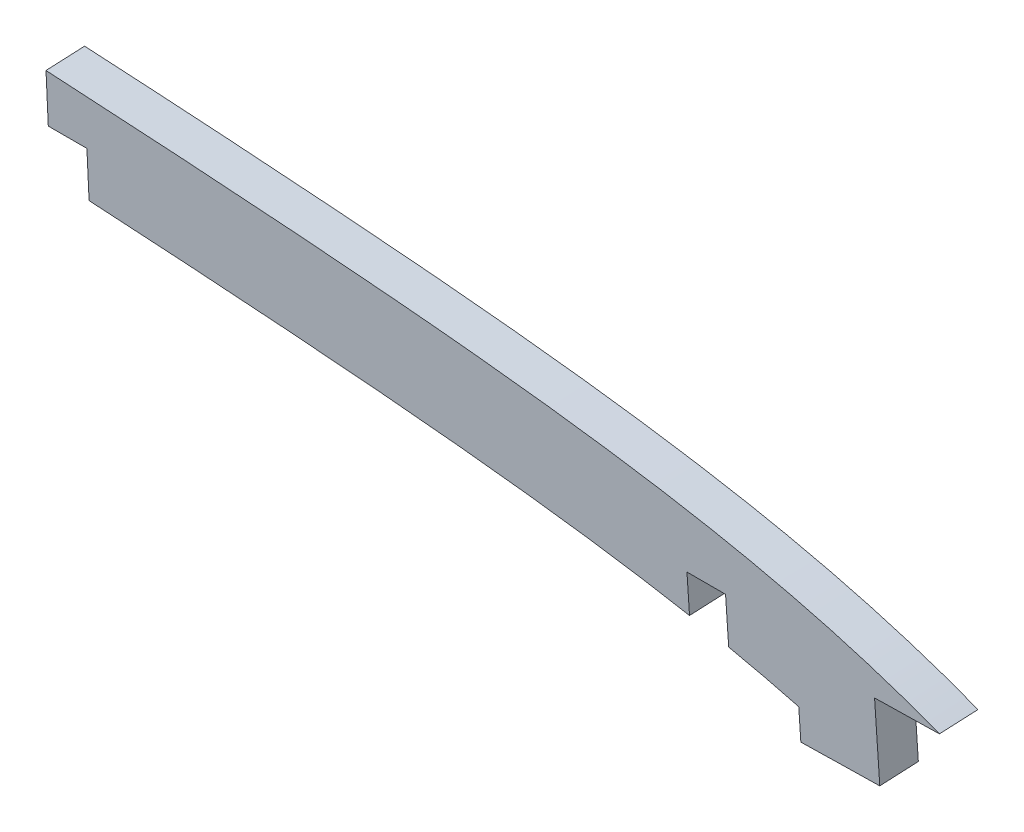
ISO-10303-21;
HEADER;
FILE_DESCRIPTION(('STEP AP214'),'2;1');
FILE_NAME('part.step','',(''),(''),'','','');
FILE_SCHEMA(('AUTOMOTIVE_DESIGN { 1 0 10303 214 1 1 1 1 }'));
ENDSEC;
DATA;
#1=APPLICATION_CONTEXT('core data for automotive mechanical design processes');
#2=APPLICATION_PROTOCOL_DEFINITION('international standard','automotive_design',2000,#1);
#3=PRODUCT_CONTEXT('',#1,'mechanical');
#4=PRODUCT('Part','Part','',(#3));
#5=PRODUCT_RELATED_PRODUCT_CATEGORY('part','',(#4));
#6=PRODUCT_DEFINITION_FORMATION('','',#4);
#7=PRODUCT_DEFINITION_CONTEXT('part definition',#1,'design');
#8=PRODUCT_DEFINITION('design','',#6,#7);
#9=PRODUCT_DEFINITION_SHAPE('','',#8);
#10=(LENGTH_UNIT() NAMED_UNIT(*) SI_UNIT(.MILLI.,.METRE.));
#11=(NAMED_UNIT(*) PLANE_ANGLE_UNIT() SI_UNIT($,.RADIAN.));
#12=(NAMED_UNIT(*) SI_UNIT($,.STERADIAN.) SOLID_ANGLE_UNIT());
#13=UNCERTAINTY_MEASURE_WITH_UNIT(LENGTH_MEASURE(1.E-05),#10,'distance_accuracy_value','');
#14=(GEOMETRIC_REPRESENTATION_CONTEXT(3) GLOBAL_UNCERTAINTY_ASSIGNED_CONTEXT((#13)) GLOBAL_UNIT_ASSIGNED_CONTEXT((#10,
#11,#12)) REPRESENTATION_CONTEXT('',''));
#15=CARTESIAN_POINT('',(0.,0.,0.));
#16=DIRECTION('',(0.,0.,1.));
#17=DIRECTION('',(1.,0.,0.));
#18=AXIS2_PLACEMENT_3D('',#15,#16,#17);
#19=CARTESIAN_POINT('',(336.677137196045,55.978239751583,-265.018424185533));
#20=CARTESIAN_POINT('',(334.08639032904,57.0574800362688,-264.968105141821));
#21=CARTESIAN_POINT('',(328.809112393071,58.8811545380873,-264.883043414682));
#22=CARTESIAN_POINT('',(320.428463569194,60.9194886283636,-264.787876019974));
#23=CARTESIAN_POINT('',(311.712141166937,62.433615193963,-264.717089630495));
#24=CARTESIAN_POINT('',(299.802782606343,63.9614455005889,-264.645545539701));
#25=CARTESIAN_POINT('',(284.637880817536,65.2628937936886,-264.584413616734));
#26=CARTESIAN_POINT('',(272.373199655927,66.066256323952,-264.546568759877));
#27=CARTESIAN_POINT('',(266.25281931719,66.4235908981517,-264.529710422424));
#28=B_SPLINE_CURVE_WITH_KNOTS('',3,(#19,#20,#21,#22,#23,#24,#25,#26,#27),.UNSPECIFIED.,.F.,.F.,
(4,1,1,1,1,1,4),(0.,0.121287595562183,0.242575191124365,0.363862786686548,0.48515038224873,
0.727725573373095,0.97030076449746),.UNSPECIFIED.);
#29=DIRECTION('',(3.75435237541071E-05,-0.046483980928917,0.998919034810872));
#30=VECTOR('',#29,1.);
#31=SURFACE_OF_LINEAR_EXTRUSION('',#28,#30);
#32=CARTESIAN_POINT('',(318.991844542654,61.1114280047069,-264.778890264956));
#33=VERTEX_POINT('',#32);
#34=CARTESIAN_POINT('',(269.874880558414,66.2068903435617,-264.539930559425));
#35=VERTEX_POINT('',#34);
#36=EDGE_CURVE('E131',#33,#35,#28,.T.);
#37=ORIENTED_EDGE('',*,*,#36,.F.);
#38=DIRECTION('',(3.75435237541071E-05,-0.046483980928917,0.998919034810872));
#39=VECTOR('',#38,1.);
#40=CARTESIAN_POINT('',(318.991844542654,61.1114280046927,-264.778890264636));
#41=LINE('',#40,#39);
#42=CARTESIAN_POINT('',(318.991963743342,60.9638413652443,-261.607322329146));
#43=VERTEX_POINT('',#42);
#44=EDGE_CURVE('E255',#33,#43,#41,.T.);
#45=ORIENTED_EDGE('',*,*,#44,.T.);
#46=CARTESIAN_POINT('',(336.677256396733,55.8306531121337,-261.846856250009));
#47=CARTESIAN_POINT('',(334.086509529727,56.9098933968195,-261.796537206296));
#48=CARTESIAN_POINT('',(328.809231593759,58.733567898638,-261.711475479158));
#49=CARTESIAN_POINT('',(320.428582769882,60.7719019889143,-261.61630808445));
#50=CARTESIAN_POINT('',(311.712260367625,62.2860285545137,-261.54552169497));
#51=CARTESIAN_POINT('',(299.802901807031,63.8138588611396,-261.473977604177));
#52=CARTESIAN_POINT('',(284.638000018224,65.1153071542393,-261.412845681209));
#53=CARTESIAN_POINT('',(272.373318856615,65.9186696845027,-261.375000824352));
#54=CARTESIAN_POINT('',(266.252938517878,66.2760042587023,-261.358142486899));
#55=B_SPLINE_CURVE_WITH_KNOTS('',3,(#46,#47,#48,#49,#50,#51,#52,#53,#54),.UNSPECIFIED.,.F.,.F.,
(4,1,1,1,1,1,4),(0.,0.121287595562183,0.242575191124365,0.363862786686548,0.48515038224873,
0.727725573373095,0.97030076449746),.UNSPECIFIED.);
#56=CARTESIAN_POINT('',(269.874999759102,66.0593037041123,-261.368362623901));
#57=VERTEX_POINT('',#56);
#58=EDGE_CURVE('E160',#43,#57,#55,.T.);
#59=ORIENTED_EDGE('',*,*,#58,.T.);
#60=DIRECTION('',(3.75435237541071E-05,-0.046483980928917,0.998919034810872));
#61=VECTOR('',#60,1.);
#62=CARTESIAN_POINT('',(269.874880558414,66.2068903435617,-264.539930559425));
#63=LINE('',#62,#61);
#64=EDGE_CURVE('E144',#35,#57,#63,.T.);
#65=ORIENTED_EDGE('',*,*,#64,.F.);
#66=EDGE_LOOP('',(#37,#45,#59,#65));
#67=FACE_BOUND('',#66,.T.);
#68=ADVANCED_FACE('F33',(#67),#31,.F.);
#69=CARTESIAN_POINT('',(266.699880799312,74.0679439383684,-264.174002738127));
#70=CARTESIAN_POINT('',(269.877550369383,73.8823221457304,-264.182759945145));
#71=CARTESIAN_POINT('',(273.054133998349,73.684406966526,-264.192089175277));
#72=CARTESIAN_POINT('',(279.404957262952,73.2620414525515,-264.211982341878));
#73=CARTESIAN_POINT('',(282.579220083787,73.0378535856233,-264.222534065467));
#74=CARTESIAN_POINT('',(288.924475008457,72.5524517291704,-264.245360373779));
#75=CARTESIAN_POINT('',(292.095475714075,72.2913351160608,-264.257630427484));
#76=CARTESIAN_POINT('',(298.432133014621,71.7086039325101,-264.2849855631));
#77=CARTESIAN_POINT('',(301.597781826907,71.3869012587405,-264.300074744543));
#78=CARTESIAN_POINT('',(306.339667277067,70.8297704762394,-264.32617864571));
#79=CARTESIAN_POINT('',(307.919193223692,70.6315789578378,-264.335460711031));
#80=CARTESIAN_POINT('',(311.075481176586,70.2039067589264,-264.355480756513));
#81=CARTESIAN_POINT('',(312.653258373727,69.9742530169902,-264.366226828118));
#82=CARTESIAN_POINT('',(317.371027628388,69.2285059736177,-264.401106945335));
#83=CARTESIAN_POINT('',(320.496662245927,68.6563155562024,-264.427850890396));
#84=CARTESIAN_POINT('',(326.689588383179,67.2879767445748,-264.491758311588));
#85=CARTESIAN_POINT('',(329.756716688684,66.4912018302597,-264.528950936246));
#86=CARTESIAN_POINT('',(334.295041763634,65.0566337106537,-264.595878104013));
#87=CARTESIAN_POINT('',(335.797388514328,64.538413977421,-264.620049552095));
#88=CARTESIAN_POINT('',(338.032747572729,63.6913706304999,-264.659550120874));
#89=CARTESIAN_POINT('',(338.774839676018,63.3974010565232,-264.673257675086));
#90=CARTESIAN_POINT('',(340.252531209307,62.7845388923394,-264.701832314176));
#91=CARTESIAN_POINT('',(340.988495660434,62.4654226926826,-264.716709818277));
#92=CARTESIAN_POINT('',(341.715968368435,62.1353756292688,-264.73209566313));
#93=B_SPLINE_CURVE_WITH_KNOTS('',3,(#69,#70,#71,#72,#73,#74,#75,#76,#77,#78,#79,#80,#81,#82,#83,
#84,#85,#86,#87,#88,#89,#90,#91,#92),.UNSPECIFIED.,.F.,.F.,(4,2,2,2,2,2,2,2,2,2,2,4),(0.,
0.124999999999999,0.249999999999999,0.374999999999998,0.499999999999998,0.562499999999999,0.625,
0.749999999999999,0.874999999999999,0.937499999999998,0.968749999999999,1.),.UNSPECIFIED.);
#94=DIRECTION('',(3.75435237541071E-05,-0.046483980928917,0.998919034810872));
#95=VECTOR('',#94,1.);
#96=SURFACE_OF_LINEAR_EXTRUSION('',#93,#95);
#97=CARTESIAN_POINT('',(266.7,73.9203572989191,-261.002434802603));
#98=CARTESIAN_POINT('',(269.877669570071,73.7347355062811,-261.011192009621));
#99=CARTESIAN_POINT('',(273.054253199037,73.5368203270767,-261.020521239752));
#100=CARTESIAN_POINT('',(279.40507646364,73.1144548131022,-261.040414406354));
#101=CARTESIAN_POINT('',(282.579339284475,72.890266946174,-261.050966129942));
#102=CARTESIAN_POINT('',(288.924594209145,72.4048650897211,-261.073792438254));
#103=CARTESIAN_POINT('',(292.095594914763,72.1437484766115,-261.086062491959));
#104=CARTESIAN_POINT('',(298.432252215309,71.5610172930608,-261.113417627575));
#105=CARTESIAN_POINT('',(301.597901027595,71.2393146192912,-261.128506809019));
#106=CARTESIAN_POINT('',(306.339786477755,70.68218383679,-261.154610710185));
#107=CARTESIAN_POINT('',(307.91931242438,70.4839923183885,-261.163892775506));
#108=CARTESIAN_POINT('',(311.075600377274,70.0563201194771,-261.183912820988));
#109=CARTESIAN_POINT('',(312.653377574415,69.8266663775409,-261.194658892594));
#110=CARTESIAN_POINT('',(317.371146829075,69.0809193341684,-261.22953900981));
#111=CARTESIAN_POINT('',(320.496781446615,68.5087289167531,-261.256282954872));
#112=CARTESIAN_POINT('',(326.689707583867,67.1403901051255,-261.320190376063));
#113=CARTESIAN_POINT('',(329.756835889372,66.3436151908104,-261.357383000722));
#114=CARTESIAN_POINT('',(334.295160964322,64.9090470712044,-261.424310168489));
#115=CARTESIAN_POINT('',(335.797507715016,64.3908273379716,-261.44848161657));
#116=CARTESIAN_POINT('',(338.032866773417,63.5437839910506,-261.48798218535));
#117=CARTESIAN_POINT('',(338.774958876706,63.2498144170739,-261.501689739562));
#118=CARTESIAN_POINT('',(339.550469468434,62.9281768568071,-261.51668605968));
#119=CARTESIAN_POINT('',(339.587127198027,62.9129391404212,-261.517396513634));
#120=CARTESIAN_POINT('',(339.623777146508,62.8976704002023,-261.518108410967));
#121=B_SPLINE_CURVE_WITH_KNOTS('',3,(#97,#98,#99,#100,#101,#102,#103,#104,#105,#106,#107,#108,
#109,#110,#111,#112,#113,#114,#115,#116,#117,#118,#119,#120),.UNSPECIFIED.,.F.,.F.,(4,2,2,2,2,2,
2,2,2,2,2,4),(0.,0.124999999999999,0.249999999999999,0.374999999999998,0.499999999999998,
0.562499999999999,0.625,0.749999999999999,0.874999999999999,0.937499999999998,0.968749999999999,
0.970300764497264),.UNSPECIFIED.);
#122=CARTESIAN_POINT('',(266.7,73.9203572989191,-261.002434802603));
#123=VERTEX_POINT('',#122);
#124=CARTESIAN_POINT('',(339.623777146505,62.8976704001962,-261.518108410968));
#125=VERTEX_POINT('',#124);
#126=EDGE_CURVE('E231',#123,#125,#121,.T.);
#127=ORIENTED_EDGE('',*,*,#126,.T.);
#128=DIRECTION('',(3.75435237541071E-05,-0.046483980928917,0.998919034810872));
#129=VECTOR('',#128,1.);
#130=CARTESIAN_POINT('',(339.623657945817,63.0452570396455,-264.689676346492));
#131=LINE('',#130,#129);
#132=CARTESIAN_POINT('',(339.623657945817,63.0452570396455,-264.689676346492));
#133=VERTEX_POINT('',#132);
#134=EDGE_CURVE('E186',#133,#125,#131,.T.);
#135=ORIENTED_EDGE('',*,*,#134,.F.);
#136=CARTESIAN_POINT('',(339.62365794582,63.0452570396516,-264.689676346492));
#137=CARTESIAN_POINT('',(339.587007997339,63.0605257798705,-264.688964449158));
#138=CARTESIAN_POINT('',(339.550350267746,63.0757634962564,-264.688253995204));
#139=CARTESIAN_POINT('',(338.774839676018,63.3974010565232,-264.673257675086));
#140=CARTESIAN_POINT('',(338.032747572729,63.6913706304999,-264.659550120874));
#141=CARTESIAN_POINT('',(335.797388514328,64.538413977421,-264.620049552095));
#142=CARTESIAN_POINT('',(334.295041763634,65.0566337106537,-264.595878104013));
#143=CARTESIAN_POINT('',(329.756716688684,66.4912018302597,-264.528950936246));
#144=CARTESIAN_POINT('',(326.689588383179,67.2879767445748,-264.491758311588));
#145=CARTESIAN_POINT('',(320.496662245927,68.6563155562024,-264.427850890396));
#146=CARTESIAN_POINT('',(317.371027628388,69.2285059736177,-264.401106945335));
#147=CARTESIAN_POINT('',(312.653258373727,69.9742530169902,-264.366226828118));
#148=CARTESIAN_POINT('',(311.075481176586,70.2039067589264,-264.355480756513));
#149=CARTESIAN_POINT('',(307.919193223692,70.6315789578378,-264.335460711031));
#150=CARTESIAN_POINT('',(306.339667277067,70.8297704762394,-264.32617864571));
#151=CARTESIAN_POINT('',(301.597781826907,71.3869012587405,-264.300074744543));
#152=CARTESIAN_POINT('',(298.432133014621,71.7086039325101,-264.2849855631));
#153=CARTESIAN_POINT('',(292.095475714075,72.2913351160608,-264.257630427484));
#154=CARTESIAN_POINT('',(288.924475008457,72.5524517291704,-264.245360373779));
#155=CARTESIAN_POINT('',(282.579220083787,73.0378535856233,-264.222534065467));
#156=CARTESIAN_POINT('',(279.404957262952,73.2620414525515,-264.211982341878));
#157=CARTESIAN_POINT('',(273.054133998349,73.684406966526,-264.192089175277));
#158=CARTESIAN_POINT('',(269.877550369383,73.8823221457304,-264.182759945145));
#159=CARTESIAN_POINT('',(266.699880799312,74.0679439383684,-264.174002738127));
#160=B_SPLINE_CURVE_WITH_KNOTS('',3,(#136,#137,#138,#139,#140,#141,#142,#143,#144,#145,#146,
#147,#148,#149,#150,#151,#152,#153,#154,#155,#156,#157,#158,#159),.UNSPECIFIED.,.F.,.F.,(4,2,2,
2,2,2,2,2,2,2,2,4),(0.,0.0015507644972661,0.032800764497267,0.0953007644972667,
0.220300764497266,0.345300764497266,0.407800764497266,0.470300764497267,0.595300764497267,
0.720300764497266,0.845300764497266,0.970300764497265),.UNSPECIFIED.);
#161=CARTESIAN_POINT('',(266.699880799312,74.0679439383684,-264.174002738127));
#162=VERTEX_POINT('',#161);
#163=EDGE_CURVE('E189',#162,#133,#160,.F.);
#164=ORIENTED_EDGE('',*,*,#163,.F.);
#165=DIRECTION('',(3.75435237541071E-05,-0.046483980928917,0.998919034810872));
#166=VECTOR('',#165,1.);
#167=CARTESIAN_POINT('',(266.699880799312,74.0679439383684,-264.174002738127));
#168=LINE('',#167,#166);
#169=EDGE_CURVE('E149',#162,#123,#168,.T.);
#170=ORIENTED_EDGE('',*,*,#169,.T.);
#171=EDGE_LOOP('',(#127,#135,#164,#170));
#172=FACE_BOUND('',#171,.T.);
#173=ADVANCED_FACE('F35',(#172),#96,.F.);
#174=CARTESIAN_POINT('',(339.623657945817,63.0452570396455,-264.689676346492));
#175=DIRECTION('',(-0.0207424182938176,0.998704084779369,0.0464747579695279));
#176=DIRECTION('',(0.,-0.0464847590307426,0.998918999307678));
#177=AXIS2_PLACEMENT_3D('',#174,#175,#176);
#178=PLANE('',#177);
#179=DIRECTION('',(-0.999784852192614,-0.0207217412878834,-0.000926695305859196));
#180=VECTOR('',#179,1.);
#181=CARTESIAN_POINT('',(339.623777146505,62.8976704001962,-261.518108410968));
#182=LINE('',#181,#180);
#183=CARTESIAN_POINT('',(334.288508519774,62.787090553,-261.523053643316));
#184=VERTEX_POINT('',#183);
#185=EDGE_CURVE('E156',#125,#184,#182,.T.);
#186=ORIENTED_EDGE('',*,*,#185,.T.);
#187=DIRECTION('',(3.75435237541071E-05,-0.046483980928917,0.998919034810872));
#188=VECTOR('',#187,1.);
#189=CARTESIAN_POINT('',(334.288389319086,62.9346771924493,-264.69462157884));
#190=LINE('',#189,#188);
#191=CARTESIAN_POINT('',(334.288389319086,62.9346771924493,-264.69462157884));
#192=VERTEX_POINT('',#191);
#193=EDGE_CURVE('E183',#192,#184,#190,.T.);
#194=ORIENTED_EDGE('',*,*,#193,.F.);
#195=DIRECTION('',(-0.999784852192614,-0.0207217412878834,-0.000926695305859196));
#196=VECTOR('',#195,1.);
#197=CARTESIAN_POINT('',(339.623657945817,63.0452570396455,-264.689676346492));
#198=LINE('',#197,#196);
#199=EDGE_CURVE('E104',#133,#192,#198,.T.);
#200=ORIENTED_EDGE('',*,*,#199,.F.);
#201=ORIENTED_EDGE('',*,*,#134,.T.);
#202=EDGE_LOOP('',(#186,#194,#200,#201));
#203=FACE_BOUND('',#202,.T.);
#204=ADVANCED_FACE('F298',(#203),#178,.F.);
#205=CARTESIAN_POINT('',(334.288389319086,62.9346771924493,-264.69462157884));
#206=DIRECTION('',(-0.999784852192615,-0.0207217412878789,-0.000926695305858988));
#207=DIRECTION('',(0.0207217501854293,-0.999785281482606,0.));
#208=AXIS2_PLACEMENT_3D('',#205,#206,#207);
#209=PLANE('',#208);
#210=DIRECTION('',(0.0207424182938131,-0.99870408477937,-0.0464747579695281));
#211=VECTOR('',#210,1.);
#212=CARTESIAN_POINT('',(334.288508519774,62.787090553,-261.523053643316));
#213=LINE('',#212,#211);
#214=CARTESIAN_POINT('',(334.42022287594,56.445319614651,-261.818168356422));
#215=VERTEX_POINT('',#214);
#216=EDGE_CURVE('E153',#184,#215,#213,.T.);
#217=ORIENTED_EDGE('',*,*,#216,.T.);
#218=DIRECTION('',(3.75435237541071E-05,-0.046483980928917,0.998919034810872));
#219=VECTOR('',#218,1.);
#220=CARTESIAN_POINT('',(334.420103675252,56.5929062541003,-264.989736291947));
#221=LINE('',#220,#219);
#222=CARTESIAN_POINT('',(334.420103675252,56.5929062541003,-264.989736291947));
#223=VERTEX_POINT('',#222);
#224=EDGE_CURVE('E180',#223,#215,#221,.T.);
#225=ORIENTED_EDGE('',*,*,#224,.F.);
#226=DIRECTION('',(0.0207424182938131,-0.99870408477937,-0.0464747579695281));
#227=VECTOR('',#226,1.);
#228=CARTESIAN_POINT('',(334.288389319086,62.9346771924493,-264.69462157884));
#229=LINE('',#228,#227);
#230=EDGE_CURVE('E267',#192,#223,#229,.T.);
#231=ORIENTED_EDGE('',*,*,#230,.F.);
#232=ORIENTED_EDGE('',*,*,#193,.T.);
#233=EDGE_LOOP('',(#217,#225,#231,#232));
#234=FACE_BOUND('',#233,.T.);
#235=ADVANCED_FACE('F295',(#234),#209,.F.);
#236=CARTESIAN_POINT('',(334.420103675252,56.5929062541003,-264.989736291947));
#237=DIRECTION('',(-0.0207424182938081,0.99870408477937,0.0464747579695279));
#238=DIRECTION('',(0.,-0.0464847590307426,0.998918999307678));
#239=AXIS2_PLACEMENT_3D('',#236,#237,#238);
#240=PLANE('',#239);
#241=DIRECTION('',(-0.999784852192615,-0.0207217412878739,-0.000926695305858923));
#242=VECTOR('',#241,1.);
#243=CARTESIAN_POINT('',(334.42022287594,56.445319614651,-261.818168356422));
#244=LINE('',#243,#242);
#245=CARTESIAN_POINT('',(327.926261169867,56.3107244623925,-261.824187575273));
#246=VERTEX_POINT('',#245);
#247=EDGE_CURVE('E155',#215,#246,#244,.T.);
#248=ORIENTED_EDGE('',*,*,#247,.T.);
#249=DIRECTION('',(3.75435237541071E-05,-0.046483980928917,0.998919034810872));
#250=VECTOR('',#249,1.);
#251=CARTESIAN_POINT('',(327.926141969179,56.4583111018418,-264.995755510798));
#252=LINE('',#251,#250);
#253=CARTESIAN_POINT('',(327.926141969179,56.4583111018418,-264.995755510798));
#254=VERTEX_POINT('',#253);
#255=EDGE_CURVE('E177',#254,#246,#252,.T.);
#256=ORIENTED_EDGE('',*,*,#255,.F.);
#257=DIRECTION('',(-0.999784852192615,-0.0207217412878739,-0.000926695305858923));
#258=VECTOR('',#257,1.);
#259=CARTESIAN_POINT('',(334.420103675252,56.5929062541003,-264.989736291947));
#260=LINE('',#259,#258);
#261=EDGE_CURVE('E272',#223,#254,#260,.T.);
#262=ORIENTED_EDGE('',*,*,#261,.F.);
#263=ORIENTED_EDGE('',*,*,#224,.T.);
#264=EDGE_LOOP('',(#248,#256,#262,#263));
#265=FACE_BOUND('',#264,.T.);
#266=ADVANCED_FACE('F291',(#265),#240,.F.);
#267=CARTESIAN_POINT('',(327.926141969179,56.4583111018418,-264.995755510798));
#268=DIRECTION('',(0.999784852192485,0.0207217412941143,0.000926695306149154));
#269=DIRECTION('',(-0.0207217501916648,0.999785281482476,0.));
#270=AXIS2_PLACEMENT_3D('',#267,#268,#269);
#271=PLANE('',#270);
#272=DIRECTION('',(-0.0207424183000552,0.99870408477924,0.046474757969523));
#273=VECTOR('',#272,1.);
#274=CARTESIAN_POINT('',(327.926261169867,56.3107244623925,-261.824187575273));
#275=LINE('',#274,#273);
#276=CARTESIAN_POINT('',(327.873224810077,58.8643143282505,-261.705356108798));
#277=VERTEX_POINT('',#276);
#278=EDGE_CURVE('E158',#246,#277,#275,.T.);
#279=ORIENTED_EDGE('',*,*,#278,.T.);
#280=DIRECTION('',(3.75435237541071E-05,-0.046483980928917,0.998919034810872));
#281=VECTOR('',#280,1.);
#282=CARTESIAN_POINT('',(327.873105609389,59.0119009676999,-264.876924044322));
#283=LINE('',#282,#281);
#284=CARTESIAN_POINT('',(327.873105609389,59.0119009676999,-264.876924044322));
#285=VERTEX_POINT('',#284);
#286=EDGE_CURVE('E174',#285,#277,#283,.T.);
#287=ORIENTED_EDGE('',*,*,#286,.F.);
#288=DIRECTION('',(-0.0207424183000552,0.99870408477924,0.046474757969523));
#289=VECTOR('',#288,1.);
#290=CARTESIAN_POINT('',(327.926141969179,56.4583111018418,-264.995755510798));
#291=LINE('',#290,#289);
#292=EDGE_CURVE('E274',#254,#285,#291,.T.);
#293=ORIENTED_EDGE('',*,*,#292,.F.);
#294=ORIENTED_EDGE('',*,*,#255,.T.);
#295=EDGE_LOOP('',(#279,#287,#293,#294));
#296=FACE_BOUND('',#295,.T.);
#297=ADVANCED_FACE('F287',(#296),#271,.F.);
#298=CARTESIAN_POINT('',(322.180853248815,60.2950960457847,-261.638561764679));
#299=VERTEX_POINT('',#298);
#300=EDGE_CURVE('E161',#277,#299,#55,.T.);
#301=ORIENTED_EDGE('',*,*,#300,.T.);
#302=DIRECTION('',(-3.75435237809755E-05,0.0464839809285407,-0.998919034810889));
#303=VECTOR('',#302,1.);
#304=CARTESIAN_POINT('',(322.180884270969,60.2566864050741,-260.813156529132));
#305=LINE('',#304,#303);
#306=CARTESIAN_POINT('',(322.180734048126,60.4426826852491,-264.810129700523));
#307=VERTEX_POINT('',#306);
#308=EDGE_CURVE('E50',#299,#307,#305,.T.);
#309=ORIENTED_EDGE('',*,*,#308,.T.);
#310=EDGE_CURVE('E135',#285,#307,#28,.T.);
#311=ORIENTED_EDGE('',*,*,#310,.F.);
#312=ORIENTED_EDGE('',*,*,#286,.T.);
#313=EDGE_LOOP('',(#301,#309,#311,#312));
#314=FACE_BOUND('',#313,.T.);
#315=ADVANCED_FACE('F283',(#314),#31,.F.);
#316=CARTESIAN_POINT('',(269.874880673958,70.0127718688735,-264.362826591965));
#317=DIRECTION('',(0.999999999295242,1.71487876938021E-06,-3.75043502326791E-05));
#318=DIRECTION('',(-3.75043502327342E-05,0.,-0.999999999296712));
#319=AXIS2_PLACEMENT_3D('',#316,#317,#318);
#320=PLANE('',#319);
#321=DIRECTION('',(3.03264558405785E-08,0.99891903551492,0.0464839809605459));
#322=VECTOR('',#321,1.);
#323=CARTESIAN_POINT('',(269.874999874646,69.8651852294242,-261.191258656441));
#324=LINE('',#323,#322);
#325=CARTESIAN_POINT('',(269.874999874646,69.8651852294242,-261.191258656441));
#326=VERTEX_POINT('',#325);
#327=EDGE_CURVE('E141',#57,#326,#324,.T.);
#328=ORIENTED_EDGE('',*,*,#327,.T.);
#329=DIRECTION('',(3.75435237541071E-05,-0.046483980928917,0.998919034810872));
#330=VECTOR('',#329,1.);
#331=CARTESIAN_POINT('',(269.874880673958,70.0127718688735,-264.362826591965));
#332=LINE('',#331,#330);
#333=CARTESIAN_POINT('',(269.874880673958,70.0127718688735,-264.362826591965));
#334=VERTEX_POINT('',#333);
#335=EDGE_CURVE('E138',#334,#326,#332,.T.);
#336=ORIENTED_EDGE('',*,*,#335,.F.);
#337=DIRECTION('',(3.03264558405785E-08,0.99891903551492,0.0464839809605459));
#338=VECTOR('',#337,1.);
#339=CARTESIAN_POINT('',(269.874880673958,70.0127718688735,-264.362826591965));
#340=LINE('',#339,#338);
#341=EDGE_CURVE('E122',#35,#334,#340,.T.);
#342=ORIENTED_EDGE('',*,*,#341,.F.);
#343=ORIENTED_EDGE('',*,*,#64,.T.);
#344=EDGE_LOOP('',(#328,#336,#342,#343));
#345=FACE_BOUND('',#344,.T.);
#346=ADVANCED_FACE('F139',(#345),#320,.F.);
#347=CARTESIAN_POINT('',(266.699880676195,70.0127664241334,-264.362707515653));
#348=DIRECTION('',(3.03264567554863E-08,0.998919035514921,0.0464839809605396));
#349=DIRECTION('',(0.,-0.0464839809605396,0.998919035514921));
#350=AXIS2_PLACEMENT_3D('',#347,#348,#349);
#351=PLANE('',#350);
#352=DIRECTION('',(-0.999999999295241,-1.71487876829741E-06,3.75043502290974E-05));
#353=VECTOR('',#352,1.);
#354=CARTESIAN_POINT('',(266.699999876883,69.8651797846841,-261.191139580129));
#355=LINE('',#354,#353);
#356=CARTESIAN_POINT('',(266.699999876883,69.8651797846841,-261.191139580129));
#357=VERTEX_POINT('',#356);
#358=EDGE_CURVE('E170',#326,#357,#355,.T.);
#359=ORIENTED_EDGE('',*,*,#358,.T.);
#360=DIRECTION('',(3.75435237541071E-05,-0.046483980928917,0.998919034810872));
#361=VECTOR('',#360,1.);
#362=CARTESIAN_POINT('',(266.699880676195,70.0127664241334,-264.362707515653));
#363=LINE('',#362,#361);
#364=CARTESIAN_POINT('',(266.699880676195,70.0127664241334,-264.362707515653));
#365=VERTEX_POINT('',#364);
#366=EDGE_CURVE('E145',#365,#357,#363,.T.);
#367=ORIENTED_EDGE('',*,*,#366,.F.);
#368=DIRECTION('',(-0.999999999295241,-1.71487876829741E-06,3.75043502290974E-05));
#369=VECTOR('',#368,1.);
#370=CARTESIAN_POINT('',(266.699880676195,70.0127664241334,-264.362707515653));
#371=LINE('',#370,#369);
#372=EDGE_CURVE('E127',#334,#365,#371,.T.);
#373=ORIENTED_EDGE('',*,*,#372,.F.);
#374=ORIENTED_EDGE('',*,*,#335,.T.);
#375=EDGE_LOOP('',(#359,#367,#373,#374));
#376=FACE_BOUND('',#375,.T.);
#377=ADVANCED_FACE('F147',(#376),#351,.F.);
#378=CARTESIAN_POINT('',(266.699880799312,74.0679439383684,-264.174002738127));
#379=DIRECTION('',(0.999999999295242,1.71487769007974E-06,-3.75043502829036E-05));
#380=DIRECTION('',(-3.75043502829587E-05,0.,-0.999999999296712));
#381=AXIS2_PLACEMENT_3D('',#378,#379,#380);
#382=PLANE('',#381);
#383=DIRECTION('',(3.03275363086979E-08,0.998919035514921,0.0464839809605379));
#384=VECTOR('',#383,1.);
#385=CARTESIAN_POINT('',(266.7,73.9203572989191,-261.002434802603));
#386=LINE('',#385,#384);
#387=EDGE_CURVE('E95',#357,#123,#386,.T.);
#388=ORIENTED_EDGE('',*,*,#387,.T.);
#389=ORIENTED_EDGE('',*,*,#169,.F.);
#390=DIRECTION('',(3.03275363086979E-08,0.998919035514921,0.0464839809605379));
#391=VECTOR('',#390,1.);
#392=CARTESIAN_POINT('',(266.699880799312,74.0679439383684,-264.174002738127));
#393=LINE('',#392,#391);
#394=EDGE_CURVE('E59',#365,#162,#393,.T.);
#395=ORIENTED_EDGE('',*,*,#394,.F.);
#396=ORIENTED_EDGE('',*,*,#366,.T.);
#397=EDGE_LOOP('',(#388,#389,#395,#396));
#398=FACE_BOUND('',#397,.T.);
#399=ADVANCED_FACE('F206',(#398),#382,.F.);
#400=CARTESIAN_POINT('',(304.759038793681,71.0154807370731,-264.317477345321));
#401=DIRECTION('',(3.7543523522398E-05,-0.0464839809327049,0.998919034810696));
#402=DIRECTION('',(0.,-0.998919035514692,-0.0464839809654649));
#403=AXIS2_PLACEMENT_3D('',#400,#401,#402);
#404=PLANE('',#403);
#405=DIRECTION('',(0.999999999295241,1.71487876392645E-06,-3.75043502640651E-05));
#406=VECTOR('',#405,1.);
#407=CARTESIAN_POINT('',(318.926688430178,64.2485586302671,-264.632903692194));
#408=LINE('',#407,#406);
#409=CARTESIAN_POINT('',(318.926688430178,64.2485586302671,-264.632903692194));
#410=VERTEX_POINT('',#409);
#411=CARTESIAN_POINT('',(322.101688427941,64.2485640750072,-264.633022768506));
#412=VERTEX_POINT('',#411);
#413=EDGE_CURVE('E444',#410,#412,#408,.T.);
#414=ORIENTED_EDGE('',*,*,#413,.F.);
#415=DIRECTION('',(-0.0207424182938072,0.998704084779388,0.046474757969147));
#416=VECTOR('',#415,1.);
#417=CARTESIAN_POINT('',(319.007100089497,60.3769053115583,-264.813071325099));
#418=LINE('',#417,#416);
#419=EDGE_CURVE('E254',#33,#410,#418,.T.);
#420=ORIENTED_EDGE('',*,*,#419,.F.);
#421=ORIENTED_EDGE('',*,*,#36,.T.);
#422=ORIENTED_EDGE('',*,*,#341,.T.);
#423=ORIENTED_EDGE('',*,*,#372,.T.);
#424=ORIENTED_EDGE('',*,*,#394,.T.);
#425=ORIENTED_EDGE('',*,*,#163,.T.);
#426=ORIENTED_EDGE('',*,*,#199,.T.);
#427=ORIENTED_EDGE('',*,*,#230,.T.);
#428=ORIENTED_EDGE('',*,*,#261,.T.);
#429=ORIENTED_EDGE('',*,*,#292,.T.);
#430=ORIENTED_EDGE('',*,*,#310,.T.);
#431=DIRECTION('',(0.0207424182938199,-0.998704084779387,-0.0464747579691481));
#432=VECTOR('',#431,1.);
#433=CARTESIAN_POINT('',(322.101688427941,64.2485640750072,-264.633022768506));
#434=LINE('',#433,#432);
#435=EDGE_CURVE('E439',#412,#307,#434,.T.);
#436=ORIENTED_EDGE('',*,*,#435,.F.);
#437=EDGE_LOOP('',(#414,#420,#421,#422,#423,#424,#425,#426,#427,#428,#429,#430,#436));
#438=FACE_BOUND('',#437,.T.);
#439=ADVANCED_FACE('F125',(#438),#404,.F.);
#440=CARTESIAN_POINT('',(304.759157994369,70.8678940976237,-261.145909409796));
#441=DIRECTION('',(3.7543523522398E-05,-0.0464839809327049,0.998919034810696));
#442=DIRECTION('',(0.,-0.998919035514692,-0.0464839809654649));
#443=AXIS2_PLACEMENT_3D('',#440,#441,#442);
#444=PLANE('',#443);
#445=DIRECTION('',(0.0207424182938071,-0.998704084779194,-0.0464747579733102));
#446=VECTOR('',#445,1.);
#447=CARTESIAN_POINT('',(318.780227527262,71.1584975957689,-261.1329133544));
#448=LINE('',#447,#446);
#449=CARTESIAN_POINT('',(318.926807630866,64.1009719908051,-261.461335756371));
#450=VERTEX_POINT('',#449);
#451=EDGE_CURVE('E11',#450,#43,#448,.T.);
#452=ORIENTED_EDGE('',*,*,#451,.F.);
#453=DIRECTION('',(-0.999999999295242,-1.71487875171011E-06,3.75043500015417E-05));
#454=VECTOR('',#453,1.);
#455=CARTESIAN_POINT('',(304.759157788929,64.1009476950034,-261.460804407872));
#456=LINE('',#455,#454);
#457=CARTESIAN_POINT('',(322.101807628629,64.1009774355451,-261.461454832682));
#458=VERTEX_POINT('',#457);
#459=EDGE_CURVE('E43',#458,#450,#456,.T.);
#460=ORIENTED_EDGE('',*,*,#459,.F.);
#461=DIRECTION('',(-0.0207424182938197,0.998704084779194,0.0464747579733102));
#462=VECTOR('',#461,1.);
#463=CARTESIAN_POINT('',(321.953861485891,71.2242749694599,-261.129971729823));
#464=LINE('',#463,#462);
#465=EDGE_CURVE('E234',#299,#458,#464,.T.);
#466=ORIENTED_EDGE('',*,*,#465,.F.);
#467=ORIENTED_EDGE('',*,*,#300,.F.);
#468=ORIENTED_EDGE('',*,*,#278,.F.);
#469=ORIENTED_EDGE('',*,*,#247,.F.);
#470=ORIENTED_EDGE('',*,*,#216,.F.);
#471=ORIENTED_EDGE('',*,*,#185,.F.);
#472=ORIENTED_EDGE('',*,*,#126,.F.);
#473=ORIENTED_EDGE('',*,*,#387,.F.);
#474=ORIENTED_EDGE('',*,*,#358,.F.);
#475=ORIENTED_EDGE('',*,*,#327,.F.);
#476=ORIENTED_EDGE('',*,*,#58,.F.);
#477=EDGE_LOOP('',(#452,#460,#466,#467,#468,#469,#470,#471,#472,#473,#474,#475,#476));
#478=FACE_BOUND('',#477,.T.);
#479=ADVANCED_FACE('F205',(#478),#444,.T.);
#480=CARTESIAN_POINT('',(319.00725031234,60.1909090313833,-260.816098153708));
#481=DIRECTION('',(-0.999784852192615,-0.0207217412878747,-0.000926695305824077));
#482=DIRECTION('',(0.0207217501854251,-0.999785281482606,0.));
#483=AXIS2_PLACEMENT_3D('',#480,#481,#482);
#484=PLANE('',#483);
#485=ORIENTED_EDGE('',*,*,#419,.T.);
#486=DIRECTION('',(-3.75435237809755E-05,0.0464839809285407,-0.998919034810889));
#487=VECTOR('',#486,1.);
#488=CARTESIAN_POINT('',(318.926838653021,64.0625623500921,-260.635930520803));
#489=LINE('',#488,#487);
#490=EDGE_CURVE('E244',#450,#410,#489,.T.);
#491=ORIENTED_EDGE('',*,*,#490,.F.);
#492=ORIENTED_EDGE('',*,*,#451,.T.);
#493=ORIENTED_EDGE('',*,*,#44,.F.);
#494=EDGE_LOOP('',(#485,#491,#492,#493));
#495=FACE_BOUND('',#494,.T.);
#496=ADVANCED_FACE('F212',(#495),#484,.F.);
#497=CARTESIAN_POINT('',(318.926838653021,64.0625623500921,-260.635930520803));
#498=DIRECTION('',(3.03264627330125E-08,0.998919035514938,0.0464839809601634));
#499=DIRECTION('',(0.,-0.0464839809601634,0.998919035514939));
#500=AXIS2_PLACEMENT_3D('',#497,#498,#499);
#501=PLANE('',#500);
#502=ORIENTED_EDGE('',*,*,#459,.T.);
#503=ORIENTED_EDGE('',*,*,#490,.T.);
#504=ORIENTED_EDGE('',*,*,#413,.T.);
#505=DIRECTION('',(-3.75435237809755E-05,0.0464839809285407,-0.998919034810889));
#506=VECTOR('',#505,1.);
#507=CARTESIAN_POINT('',(322.101838650784,64.0625677948322,-260.636049597115));
#508=LINE('',#507,#506);
#509=EDGE_CURVE('E248',#458,#412,#508,.T.);
#510=ORIENTED_EDGE('',*,*,#509,.F.);
#511=EDGE_LOOP('',(#502,#503,#504,#510));
#512=FACE_BOUND('',#511,.T.);
#513=ADVANCED_FACE('F207',(#512),#501,.F.);
#514=CARTESIAN_POINT('',(322.101838650784,64.0625677948322,-260.636049597115));
#515=DIRECTION('',(0.999784852192614,0.0207217412878873,0.000926695305824666));
#516=DIRECTION('',(-0.0207217501854378,0.999785281482605,0.));
#517=AXIS2_PLACEMENT_3D('',#514,#515,#516);
#518=PLANE('',#517);
#519=ORIENTED_EDGE('',*,*,#465,.T.);
#520=ORIENTED_EDGE('',*,*,#509,.T.);
#521=ORIENTED_EDGE('',*,*,#435,.T.);
#522=ORIENTED_EDGE('',*,*,#308,.F.);
#523=EDGE_LOOP('',(#519,#520,#521,#522));
#524=FACE_BOUND('',#523,.T.);
#525=ADVANCED_FACE('F379',(#524),#518,.F.);
#526=CLOSED_SHELL('',(#68,#173,#204,#235,#266,#297,#315,#346,#377,#399,#439,#479,#496,#513,#525));
#527=MANIFOLD_SOLID_BREP('B2',#526);
#528=ADVANCED_BREP_SHAPE_REPRESENTATION('',(#18,#527),#14);
#529=SHAPE_DEFINITION_REPRESENTATION(#9,#528);
ENDSEC;
END-ISO-10303-21;
